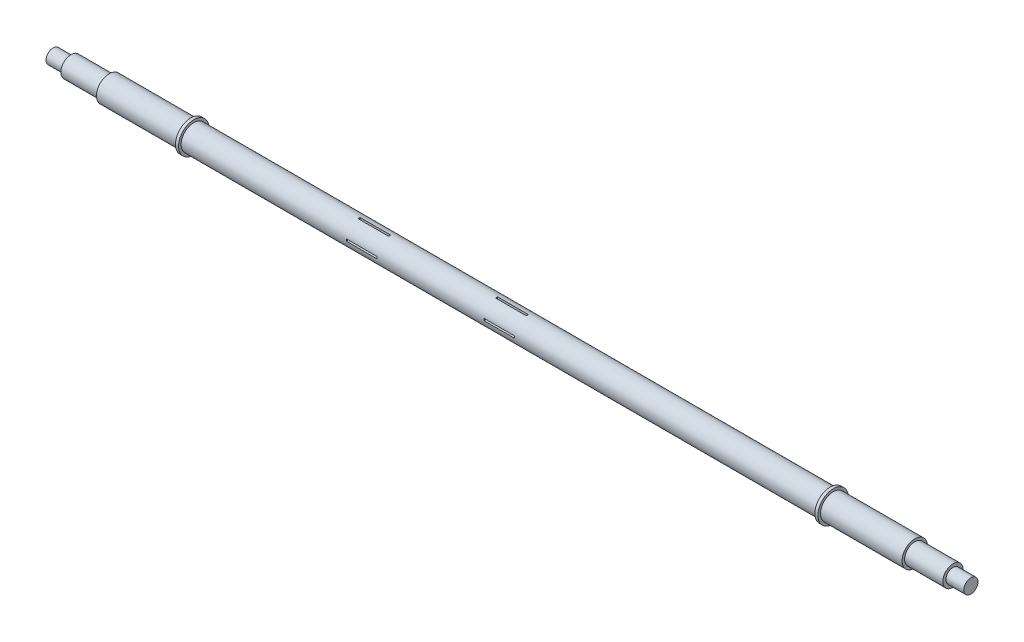
ISO-10303-21;
HEADER;
FILE_DESCRIPTION(('STEP AP214'),'2;1');
FILE_NAME('part.step','',(''),(''),'','','');
FILE_SCHEMA(('AUTOMOTIVE_DESIGN { 1 0 10303 214 1 1 1 1 }'));
ENDSEC;
DATA;
#1=APPLICATION_CONTEXT('core data for automotive mechanical design processes');
#2=APPLICATION_PROTOCOL_DEFINITION('international standard','automotive_design',2000,#1);
#3=PRODUCT_CONTEXT('',#1,'mechanical');
#4=PRODUCT('Part','Part','',(#3));
#5=PRODUCT_RELATED_PRODUCT_CATEGORY('part','',(#4));
#6=PRODUCT_DEFINITION_FORMATION('','',#4);
#7=PRODUCT_DEFINITION_CONTEXT('part definition',#1,'design');
#8=PRODUCT_DEFINITION('design','',#6,#7);
#9=PRODUCT_DEFINITION_SHAPE('','',#8);
#10=(LENGTH_UNIT() NAMED_UNIT(*) SI_UNIT(.MILLI.,.METRE.));
#11=(NAMED_UNIT(*) PLANE_ANGLE_UNIT() SI_UNIT($,.RADIAN.));
#12=(NAMED_UNIT(*) SI_UNIT($,.STERADIAN.) SOLID_ANGLE_UNIT());
#13=UNCERTAINTY_MEASURE_WITH_UNIT(LENGTH_MEASURE(1.E-05),#10,'distance_accuracy_value','');
#14=(GEOMETRIC_REPRESENTATION_CONTEXT(3) GLOBAL_UNCERTAINTY_ASSIGNED_CONTEXT((#13)) GLOBAL_UNIT_ASSIGNED_CONTEXT((#10,
#11,#12)) REPRESENTATION_CONTEXT('',''));
#15=CARTESIAN_POINT('',(0.,0.,0.));
#16=DIRECTION('',(0.,0.,1.));
#17=DIRECTION('',(1.,0.,0.));
#18=AXIS2_PLACEMENT_3D('',#15,#16,#17);
#19=CARTESIAN_POINT('',(-450.,0.,0.));
#20=DIRECTION('',(-1.,0.,0.));
#21=DIRECTION('',(0.,0.,1.));
#22=AXIS2_PLACEMENT_3D('',#19,#20,#21);
#23=CYLINDRICAL_SURFACE('',#22,12.5);
#24=CARTESIAN_POINT('',(-150.,0.,0.));
#25=DIRECTION('',(1.,0.,0.));
#26=DIRECTION('',(0.,0.,-1.));
#27=AXIS2_PLACEMENT_3D('',#24,#25,#26);
#28=CIRCLE('',#27,12.5);
#29=CARTESIAN_POINT('',(-150.,0.999999999999994,12.4599357943771));
#30=VERTEX_POINT('',#29);
#31=CARTESIAN_POINT('',(-150.,-0.999999999999996,12.4599357943771));
#32=VERTEX_POINT('',#31);
#33=EDGE_CURVE('E801',#30,#32,#28,.T.);
#34=ORIENTED_EDGE('',*,*,#33,.F.);
#35=DIRECTION('',(1.,0.,0.));
#36=VECTOR('',#35,1.);
#37=CARTESIAN_POINT('',(-150.,0.999999999999994,12.4599357943771));
#38=LINE('',#37,#36);
#39=CARTESIAN_POINT('',(-120.,0.999999999999994,12.4599357943771));
#40=VERTEX_POINT('',#39);
#41=EDGE_CURVE('E233',#30,#40,#38,.T.);
#42=ORIENTED_EDGE('',*,*,#41,.T.);
#43=CARTESIAN_POINT('',(-120.,0.,0.));
#44=DIRECTION('',(1.,0.,0.));
#45=DIRECTION('',(0.,0.,-1.));
#46=AXIS2_PLACEMENT_3D('',#43,#44,#45);
#47=CIRCLE('',#46,12.5);
#48=CARTESIAN_POINT('',(-120.,-0.999999999999996,12.4599357943771));
#49=VERTEX_POINT('',#48);
#50=EDGE_CURVE('E799',#40,#49,#47,.T.);
#51=ORIENTED_EDGE('',*,*,#50,.T.);
#52=DIRECTION('',(1.,0.,0.));
#53=VECTOR('',#52,1.);
#54=CARTESIAN_POINT('',(-150.,-0.999999999999996,12.4599357943771));
#55=LINE('',#54,#53);
#56=EDGE_CURVE('E795',#32,#49,#55,.T.);
#57=ORIENTED_EDGE('',*,*,#56,.F.);
#58=EDGE_LOOP('',(#34,#42,#51,#57));
#59=FACE_BOUND('',#58,.T.);
#60=CARTESIAN_POINT('',(-150.,0.,0.));
#61=DIRECTION('',(1.,0.,0.));
#62=DIRECTION('',(0.,0.,-1.));
#63=AXIS2_PLACEMENT_3D('',#60,#61,#62);
#64=CIRCLE('',#63,12.5);
#65=CARTESIAN_POINT('',(-150.,-1.,-12.4599357943771));
#66=VERTEX_POINT('',#65);
#67=CARTESIAN_POINT('',(-150.,0.999999999999995,-12.4599357943771));
#68=VERTEX_POINT('',#67);
#69=EDGE_CURVE('E822',#66,#68,#64,.T.);
#70=ORIENTED_EDGE('',*,*,#69,.F.);
#71=DIRECTION('',(1.,0.,0.));
#72=VECTOR('',#71,1.);
#73=CARTESIAN_POINT('',(-150.,-1.,-12.4599357943771));
#74=LINE('',#73,#72);
#75=CARTESIAN_POINT('',(-120.,-1.,-12.4599357943771));
#76=VERTEX_POINT('',#75);
#77=EDGE_CURVE('E782',#66,#76,#74,.T.);
#78=ORIENTED_EDGE('',*,*,#77,.T.);
#79=CARTESIAN_POINT('',(-120.,0.,0.));
#80=DIRECTION('',(1.,0.,0.));
#81=DIRECTION('',(0.,0.,-1.));
#82=AXIS2_PLACEMENT_3D('',#79,#80,#81);
#83=CIRCLE('',#82,12.5);
#84=CARTESIAN_POINT('',(-120.,0.999999999999995,-12.4599357943771));
#85=VERTEX_POINT('',#84);
#86=EDGE_CURVE('E842',#76,#85,#83,.T.);
#87=ORIENTED_EDGE('',*,*,#86,.T.);
#88=DIRECTION('',(1.,0.,0.));
#89=VECTOR('',#88,1.);
#90=CARTESIAN_POINT('',(-150.,0.999999999999995,-12.4599357943771));
#91=LINE('',#90,#89);
#92=EDGE_CURVE('E776',#68,#85,#91,.T.);
#93=ORIENTED_EDGE('',*,*,#92,.F.);
#94=EDGE_LOOP('',(#70,#78,#87,#93));
#95=FACE_BOUND('',#94,.T.);
#96=DIRECTION('',(-1.,0.,0.));
#97=VECTOR('',#96,1.);
#98=CARTESIAN_POINT('',(15.,12.4599357943771,-1.00000000000041));
#99=LINE('',#98,#97);
#100=CARTESIAN_POINT('',(15.,12.4599357943771,-1.00000000000041));
#101=VERTEX_POINT('',#100);
#102=CARTESIAN_POINT('',(-15.,12.4599357943771,-1.0000000000004));
#103=VERTEX_POINT('',#102);
#104=EDGE_CURVE('E321',#101,#103,#99,.T.);
#105=ORIENTED_EDGE('',*,*,#104,.F.);
#106=CARTESIAN_POINT('',(15.,0.,0.));
#107=DIRECTION('',(1.,0.,0.));
#108=DIRECTION('',(0.,0.,-1.));
#109=AXIS2_PLACEMENT_3D('',#106,#107,#108);
#110=CIRCLE('',#109,12.5);
#111=CARTESIAN_POINT('',(15.,12.4599357943771,1.00000000000012));
#112=VERTEX_POINT('',#111);
#113=EDGE_CURVE('E247',#101,#112,#110,.T.);
#114=ORIENTED_EDGE('',*,*,#113,.T.);
#115=DIRECTION('',(-1.,0.,0.));
#116=VECTOR('',#115,1.);
#117=CARTESIAN_POINT('',(15.,12.4599357943771,1.00000000000012));
#118=LINE('',#117,#116);
#119=CARTESIAN_POINT('',(-15.,12.4599357943771,1.00000000000012));
#120=VERTEX_POINT('',#119);
#121=EDGE_CURVE('E318',#112,#120,#118,.T.);
#122=ORIENTED_EDGE('',*,*,#121,.T.);
#123=CARTESIAN_POINT('',(-15.,0.,0.));
#124=DIRECTION('',(1.,0.,0.));
#125=DIRECTION('',(0.,0.,-1.));
#126=AXIS2_PLACEMENT_3D('',#123,#124,#125);
#127=CIRCLE('',#126,12.5);
#128=EDGE_CURVE('E278',#103,#120,#127,.T.);
#129=ORIENTED_EDGE('',*,*,#128,.F.);
#130=EDGE_LOOP('',(#105,#114,#122,#129));
#131=FACE_BOUND('',#130,.T.);
#132=DIRECTION('',(-1.,0.,0.));
#133=VECTOR('',#132,1.);
#134=CARTESIAN_POINT('',(15.,0.999999999999994,12.4599357943771));
#135=LINE('',#134,#133);
#136=CARTESIAN_POINT('',(15.,0.999999999999994,12.4599357943771));
#137=VERTEX_POINT('',#136);
#138=CARTESIAN_POINT('',(-15.,0.999999999999993,12.4599357943771));
#139=VERTEX_POINT('',#138);
#140=EDGE_CURVE('E313',#137,#139,#135,.T.);
#141=ORIENTED_EDGE('',*,*,#140,.F.);
#142=CARTESIAN_POINT('',(15.,0.,0.));
#143=DIRECTION('',(1.,0.,0.));
#144=DIRECTION('',(0.,0.,-1.));
#145=AXIS2_PLACEMENT_3D('',#142,#143,#144);
#146=CIRCLE('',#145,12.5);
#147=CARTESIAN_POINT('',(15.,-0.999999999999997,12.4599357943771));
#148=VERTEX_POINT('',#147);
#149=EDGE_CURVE('E254',#137,#148,#146,.T.);
#150=ORIENTED_EDGE('',*,*,#149,.T.);
#151=DIRECTION('',(-1.,0.,0.));
#152=VECTOR('',#151,1.);
#153=CARTESIAN_POINT('',(15.,-0.999999999999997,12.4599357943771));
#154=LINE('',#153,#152);
#155=CARTESIAN_POINT('',(-15.,-0.999999999999997,12.4599357943771));
#156=VERTEX_POINT('',#155);
#157=EDGE_CURVE('E310',#148,#156,#154,.T.);
#158=ORIENTED_EDGE('',*,*,#157,.T.);
#159=CARTESIAN_POINT('',(-15.,0.,0.));
#160=DIRECTION('',(1.,0.,0.));
#161=DIRECTION('',(0.,0.,-1.));
#162=AXIS2_PLACEMENT_3D('',#159,#160,#161);
#163=CIRCLE('',#162,12.5);
#164=EDGE_CURVE('E285',#139,#156,#163,.T.);
#165=ORIENTED_EDGE('',*,*,#164,.F.);
#166=EDGE_LOOP('',(#141,#150,#158,#165));
#167=FACE_BOUND('',#166,.T.);
#168=DIRECTION('',(-1.,0.,0.));
#169=VECTOR('',#168,1.);
#170=CARTESIAN_POINT('',(15.,-12.4599357943771,0.999999999999845));
#171=LINE('',#170,#169);
#172=CARTESIAN_POINT('',(15.,-12.4599357943771,0.999999999999845));
#173=VERTEX_POINT('',#172);
#174=CARTESIAN_POINT('',(-15.,-12.4599357943771,0.999999999999845));
#175=VERTEX_POINT('',#174);
#176=EDGE_CURVE('E305',#173,#175,#171,.T.);
#177=ORIENTED_EDGE('',*,*,#176,.F.);
#178=CARTESIAN_POINT('',(15.,0.,0.));
#179=DIRECTION('',(1.,0.,0.));
#180=DIRECTION('',(0.,0.,-1.));
#181=AXIS2_PLACEMENT_3D('',#178,#179,#180);
#182=CIRCLE('',#181,12.5);
#183=CARTESIAN_POINT('',(15.,-12.4599357943771,-0.999999999999872));
#184=VERTEX_POINT('',#183);
#185=EDGE_CURVE('E261',#173,#184,#182,.T.);
#186=ORIENTED_EDGE('',*,*,#185,.T.);
#187=DIRECTION('',(-1.,0.,0.));
#188=VECTOR('',#187,1.);
#189=CARTESIAN_POINT('',(15.,-12.4599357943771,-0.999999999999872));
#190=LINE('',#189,#188);
#191=CARTESIAN_POINT('',(-15.,-12.4599357943771,-0.999999999999872));
#192=VERTEX_POINT('',#191);
#193=EDGE_CURVE('E302',#184,#192,#190,.T.);
#194=ORIENTED_EDGE('',*,*,#193,.T.);
#195=CARTESIAN_POINT('',(-15.,0.,0.));
#196=DIRECTION('',(1.,0.,0.));
#197=DIRECTION('',(0.,0.,-1.));
#198=AXIS2_PLACEMENT_3D('',#195,#196,#197);
#199=CIRCLE('',#198,12.5);
#200=EDGE_CURVE('E292',#175,#192,#199,.T.);
#201=ORIENTED_EDGE('',*,*,#200,.F.);
#202=EDGE_LOOP('',(#177,#186,#194,#201));
#203=FACE_BOUND('',#202,.T.);
#204=DIRECTION('',(-1.,0.,0.));
#205=VECTOR('',#204,1.);
#206=CARTESIAN_POINT('',(15.,-0.999999999999996,-12.4599357943771));
#207=LINE('',#206,#205);
#208=CARTESIAN_POINT('',(15.,-0.999999999999996,-12.4599357943771));
#209=VERTEX_POINT('',#208);
#210=CARTESIAN_POINT('',(-15.,-0.999999999999995,-12.4599357943771));
#211=VERTEX_POINT('',#210);
#212=EDGE_CURVE('E268',#209,#211,#207,.T.);
#213=ORIENTED_EDGE('',*,*,#212,.F.);
#214=CARTESIAN_POINT('',(15.,0.,0.));
#215=DIRECTION('',(1.,0.,0.));
#216=DIRECTION('',(0.,0.,-1.));
#217=AXIS2_PLACEMENT_3D('',#214,#215,#216);
#218=CIRCLE('',#217,12.5);
#219=CARTESIAN_POINT('',(15.,0.999999999999995,-12.4599357943771));
#220=VERTEX_POINT('',#219);
#221=EDGE_CURVE('E239',#209,#220,#218,.T.);
#222=ORIENTED_EDGE('',*,*,#221,.T.);
#223=DIRECTION('',(-1.,0.,0.));
#224=VECTOR('',#223,1.);
#225=CARTESIAN_POINT('',(15.,0.999999999999995,-12.4599357943771));
#226=LINE('',#225,#224);
#227=CARTESIAN_POINT('',(-15.,0.999999999999995,-12.4599357943771));
#228=VERTEX_POINT('',#227);
#229=EDGE_CURVE('E326',#220,#228,#226,.T.);
#230=ORIENTED_EDGE('',*,*,#229,.T.);
#231=CARTESIAN_POINT('',(-15.,0.,0.));
#232=DIRECTION('',(1.,0.,0.));
#233=DIRECTION('',(0.,0.,-1.));
#234=AXIS2_PLACEMENT_3D('',#231,#232,#233);
#235=CIRCLE('',#234,12.5);
#236=EDGE_CURVE('E269',#211,#228,#235,.T.);
#237=ORIENTED_EDGE('',*,*,#236,.F.);
#238=EDGE_LOOP('',(#213,#222,#230,#237));
#239=FACE_BOUND('',#238,.T.);
#240=CARTESIAN_POINT('',(-312.,0.,0.));
#241=DIRECTION('',(1.,0.,0.));
#242=DIRECTION('',(0.,0.,-1.));
#243=AXIS2_PLACEMENT_3D('',#240,#241,#242);
#244=CIRCLE('',#243,12.5);
#245=CARTESIAN_POINT('',(-312.,0.,-12.5));
#246=VERTEX_POINT('',#245);
#247=EDGE_CURVE('E339',#246,#246,#244,.T.);
#248=ORIENTED_EDGE('',*,*,#247,.T.);
#249=EDGE_LOOP('',(#248));
#250=FACE_BOUND('',#249,.T.);
#251=CARTESIAN_POINT('',(312.,0.,0.));
#252=DIRECTION('',(1.,0.,0.));
#253=DIRECTION('',(0.,0.,-1.));
#254=AXIS2_PLACEMENT_3D('',#251,#252,#253);
#255=CIRCLE('',#254,12.5);
#256=CARTESIAN_POINT('',(312.,0.,-12.5));
#257=VERTEX_POINT('',#256);
#258=EDGE_CURVE('E11',#257,#257,#255,.T.);
#259=ORIENTED_EDGE('',*,*,#258,.F.);
#260=EDGE_LOOP('',(#259));
#261=FACE_BOUND('',#260,.T.);
#262=CARTESIAN_POINT('',(-150.,0.,0.));
#263=DIRECTION('',(1.,0.,0.));
#264=DIRECTION('',(0.,0.,-1.));
#265=AXIS2_PLACEMENT_3D('',#262,#263,#264);
#266=CIRCLE('',#265,12.5);
#267=CARTESIAN_POINT('',(-150.,-12.4599357943771,0.999999999999845));
#268=VERTEX_POINT('',#267);
#269=CARTESIAN_POINT('',(-150.,-12.4599357943771,-0.999999999999863));
#270=VERTEX_POINT('',#269);
#271=EDGE_CURVE('E813',#268,#270,#266,.T.);
#272=ORIENTED_EDGE('',*,*,#271,.F.);
#273=DIRECTION('',(1.,0.,0.));
#274=VECTOR('',#273,1.);
#275=CARTESIAN_POINT('',(-150.,-12.4599357943771,0.999999999999845));
#276=LINE('',#275,#274);
#277=CARTESIAN_POINT('',(-120.,-12.4599357943771,0.999999999999845));
#278=VERTEX_POINT('',#277);
#279=EDGE_CURVE('E790',#268,#278,#276,.T.);
#280=ORIENTED_EDGE('',*,*,#279,.T.);
#281=CARTESIAN_POINT('',(-120.,0.,0.));
#282=DIRECTION('',(1.,0.,0.));
#283=DIRECTION('',(0.,0.,-1.));
#284=AXIS2_PLACEMENT_3D('',#281,#282,#283);
#285=CIRCLE('',#284,12.5);
#286=CARTESIAN_POINT('',(-120.,-12.4599357943771,-0.999999999999862));
#287=VERTEX_POINT('',#286);
#288=EDGE_CURVE('E833',#278,#287,#285,.T.);
#289=ORIENTED_EDGE('',*,*,#288,.T.);
#290=DIRECTION('',(1.,0.,0.));
#291=VECTOR('',#290,1.);
#292=CARTESIAN_POINT('',(-150.,-12.4599357943771,-0.999999999999863));
#293=LINE('',#292,#291);
#294=EDGE_CURVE('E787',#270,#287,#293,.T.);
#295=ORIENTED_EDGE('',*,*,#294,.F.);
#296=EDGE_LOOP('',(#272,#280,#289,#295));
#297=FACE_BOUND('',#296,.T.);
#298=CARTESIAN_POINT('',(-150.,0.,0.));
#299=DIRECTION('',(1.,0.,0.));
#300=DIRECTION('',(0.,0.,-1.));
#301=AXIS2_PLACEMENT_3D('',#298,#299,#300);
#302=CIRCLE('',#301,12.5);
#303=CARTESIAN_POINT('',(-150.,12.4599357943771,-1.0000000000004));
#304=VERTEX_POINT('',#303);
#305=CARTESIAN_POINT('',(-150.,12.4599357943771,1.00000000000012));
#306=VERTEX_POINT('',#305);
#307=EDGE_CURVE('E219',#304,#306,#302,.T.);
#308=ORIENTED_EDGE('',*,*,#307,.F.);
#309=DIRECTION('',(1.,0.,0.));
#310=VECTOR('',#309,1.);
#311=CARTESIAN_POINT('',(-150.,12.4599357943771,-1.0000000000004));
#312=LINE('',#311,#310);
#313=CARTESIAN_POINT('',(-120.,12.4599357943771,-1.0000000000004));
#314=VERTEX_POINT('',#313);
#315=EDGE_CURVE('E273',#304,#314,#312,.T.);
#316=ORIENTED_EDGE('',*,*,#315,.T.);
#317=CARTESIAN_POINT('',(-120.,0.,0.));
#318=DIRECTION('',(1.,0.,0.));
#319=DIRECTION('',(0.,0.,-1.));
#320=AXIS2_PLACEMENT_3D('',#317,#318,#319);
#321=CIRCLE('',#320,12.5);
#322=CARTESIAN_POINT('',(-120.,12.4599357943771,1.00000000000012));
#323=VERTEX_POINT('',#322);
#324=EDGE_CURVE('E231',#314,#323,#321,.T.);
#325=ORIENTED_EDGE('',*,*,#324,.T.);
#326=DIRECTION('',(1.,0.,0.));
#327=VECTOR('',#326,1.);
#328=CARTESIAN_POINT('',(-150.,12.4599357943771,1.00000000000012));
#329=LINE('',#328,#327);
#330=EDGE_CURVE('E212',#306,#323,#329,.T.);
#331=ORIENTED_EDGE('',*,*,#330,.F.);
#332=EDGE_LOOP('',(#308,#316,#325,#331));
#333=FACE_BOUND('',#332,.T.);
#334=ADVANCED_FACE('F47',(#59,#95,#131,#167,#203,#239,#250,#261,#297,#333),#23,.T.);
#335=CARTESIAN_POINT('',(-312.,0.,0.));
#336=DIRECTION('',(-1.,0.,0.));
#337=DIRECTION('',(0.,0.,1.));
#338=AXIS2_PLACEMENT_3D('',#335,#336,#337);
#339=CYLINDRICAL_SURFACE('',#338,15.);
#340=CARTESIAN_POINT('',(-312.,0.,0.));
#341=DIRECTION('',(1.,0.,0.));
#342=DIRECTION('',(0.,0.,-1.));
#343=AXIS2_PLACEMENT_3D('',#340,#341,#342);
#344=CIRCLE('',#343,15.);
#345=CARTESIAN_POINT('',(-312.,0.,-15.));
#346=VERTEX_POINT('',#345);
#347=EDGE_CURVE('E336',#346,#346,#344,.T.);
#348=ORIENTED_EDGE('',*,*,#347,.F.);
#349=EDGE_LOOP('',(#348));
#350=FACE_BOUND('',#349,.T.);
#351=CARTESIAN_POINT('',(-315.,0.,0.));
#352=DIRECTION('',(1.,0.,0.));
#353=DIRECTION('',(0.,0.,-1.));
#354=AXIS2_PLACEMENT_3D('',#351,#352,#353);
#355=CIRCLE('',#354,15.);
#356=CARTESIAN_POINT('',(-315.,0.,-15.));
#357=VERTEX_POINT('',#356);
#358=EDGE_CURVE('E340',#357,#357,#355,.T.);
#359=ORIENTED_EDGE('',*,*,#358,.T.);
#360=EDGE_LOOP('',(#359));
#361=FACE_BOUND('',#360,.T.);
#362=ADVANCED_FACE('F405',(#350,#361),#339,.T.);
#363=CARTESIAN_POINT('',(-312.,0.,0.));
#364=DIRECTION('',(1.,0.,0.));
#365=DIRECTION('',(0.,0.,-1.));
#366=AXIS2_PLACEMENT_3D('',#363,#364,#365);
#367=PLANE('',#366);
#368=ORIENTED_EDGE('',*,*,#247,.F.);
#369=EDGE_LOOP('',(#368));
#370=FACE_BOUND('',#369,.T.);
#371=ORIENTED_EDGE('',*,*,#347,.T.);
#372=EDGE_LOOP('',(#371));
#373=FACE_BOUND('',#372,.T.);
#374=ADVANCED_FACE('F412',(#370,#373),#367,.T.);
#375=CARTESIAN_POINT('',(-315.,0.,0.));
#376=DIRECTION('',(1.,0.,0.));
#377=DIRECTION('',(0.,0.,-1.));
#378=AXIS2_PLACEMENT_3D('',#375,#376,#377);
#379=PLANE('',#378);
#380=CARTESIAN_POINT('',(-315.,0.,0.));
#381=DIRECTION('',(1.,0.,0.));
#382=DIRECTION('',(0.,0.,-1.));
#383=AXIS2_PLACEMENT_3D('',#380,#381,#382);
#384=CIRCLE('',#383,12.5);
#385=CARTESIAN_POINT('',(-315.,0.,-12.5));
#386=VERTEX_POINT('',#385);
#387=EDGE_CURVE('E55',#386,#386,#384,.T.);
#388=ORIENTED_EDGE('',*,*,#387,.T.);
#389=EDGE_LOOP('',(#388));
#390=FACE_BOUND('',#389,.T.);
#391=ORIENTED_EDGE('',*,*,#358,.F.);
#392=EDGE_LOOP('',(#391));
#393=FACE_BOUND('',#392,.T.);
#394=ADVANCED_FACE('F528',(#390,#393),#379,.F.);
#395=CARTESIAN_POINT('',(-450.,0.,0.));
#396=DIRECTION('',(1.,0.,0.));
#397=DIRECTION('',(0.,0.,-1.));
#398=AXIS2_PLACEMENT_3D('',#395,#396,#397);
#399=PLANE('',#398);
#400=CARTESIAN_POINT('',(-450.,0.,0.));
#401=DIRECTION('',(-1.,0.,0.));
#402=DIRECTION('',(0.,0.,1.));
#403=AXIS2_PLACEMENT_3D('',#400,#401,#402);
#404=CIRCLE('',#403,7.);
#405=CARTESIAN_POINT('',(-450.,0.,7.));
#406=VERTEX_POINT('',#405);
#407=EDGE_CURVE('E343',#406,#406,#404,.T.);
#408=ORIENTED_EDGE('',*,*,#407,.T.);
#409=EDGE_LOOP('',(#408));
#410=FACE_BOUND('',#409,.T.);
#411=ADVANCED_FACE('F518',(#410),#399,.F.);
#412=CARTESIAN_POINT('',(-450.,0.,0.));
#413=DIRECTION('',(-1.,0.,0.));
#414=DIRECTION('',(0.,0.,1.));
#415=AXIS2_PLACEMENT_3D('',#412,#413,#414);
#416=CYLINDRICAL_SURFACE('',#415,7.);
#417=ORIENTED_EDGE('',*,*,#407,.F.);
#418=EDGE_LOOP('',(#417));
#419=FACE_BOUND('',#418,.T.);
#420=CARTESIAN_POINT('',(-432.5,0.,0.));
#421=DIRECTION('',(-1.,0.,0.));
#422=DIRECTION('',(0.,0.,1.));
#423=AXIS2_PLACEMENT_3D('',#420,#421,#422);
#424=CIRCLE('',#423,7.);
#425=CARTESIAN_POINT('',(-432.5,0.,7.));
#426=VERTEX_POINT('',#425);
#427=EDGE_CURVE('E346',#426,#426,#424,.T.);
#428=ORIENTED_EDGE('',*,*,#427,.T.);
#429=EDGE_LOOP('',(#428));
#430=FACE_BOUND('',#429,.T.);
#431=ADVANCED_FACE('F508',(#419,#430),#416,.T.);
#432=CARTESIAN_POINT('',(-432.5,7.,0.));
#433=DIRECTION('',(1.,0.,0.));
#434=DIRECTION('',(0.,0.,-1.));
#435=AXIS2_PLACEMENT_3D('',#432,#433,#434);
#436=PLANE('',#435);
#437=ORIENTED_EDGE('',*,*,#427,.F.);
#438=EDGE_LOOP('',(#437));
#439=FACE_BOUND('',#438,.T.);
#440=CARTESIAN_POINT('',(-432.5,0.,0.));
#441=DIRECTION('',(-1.,0.,0.));
#442=DIRECTION('',(0.,0.,1.));
#443=AXIS2_PLACEMENT_3D('',#440,#441,#442);
#444=CIRCLE('',#443,10.);
#445=CARTESIAN_POINT('',(-432.5,0.,10.));
#446=VERTEX_POINT('',#445);
#447=EDGE_CURVE('E349',#446,#446,#444,.T.);
#448=ORIENTED_EDGE('',*,*,#447,.T.);
#449=EDGE_LOOP('',(#448));
#450=FACE_BOUND('',#449,.T.);
#451=ADVANCED_FACE('F498',(#439,#450),#436,.F.);
#452=CARTESIAN_POINT('',(-450.,0.,0.));
#453=DIRECTION('',(-1.,0.,0.));
#454=DIRECTION('',(0.,0.,1.));
#455=AXIS2_PLACEMENT_3D('',#452,#453,#454);
#456=CYLINDRICAL_SURFACE('',#455,9.99999999999999);
#457=ORIENTED_EDGE('',*,*,#447,.F.);
#458=EDGE_LOOP('',(#457));
#459=FACE_BOUND('',#458,.T.);
#460=CARTESIAN_POINT('',(-395.,0.,0.));
#461=DIRECTION('',(-1.,0.,0.));
#462=DIRECTION('',(0.,0.,1.));
#463=AXIS2_PLACEMENT_3D('',#460,#461,#462);
#464=CIRCLE('',#463,9.99999999999999);
#465=CARTESIAN_POINT('',(-395.,0.,9.99999999999999));
#466=VERTEX_POINT('',#465);
#467=EDGE_CURVE('E352',#466,#466,#464,.T.);
#468=ORIENTED_EDGE('',*,*,#467,.T.);
#469=EDGE_LOOP('',(#468));
#470=FACE_BOUND('',#469,.T.);
#471=ADVANCED_FACE('F489',(#459,#470),#456,.T.);
#472=CARTESIAN_POINT('',(-395.,9.99999999999999,0.));
#473=DIRECTION('',(1.,0.,0.));
#474=DIRECTION('',(0.,0.,-1.));
#475=AXIS2_PLACEMENT_3D('',#472,#473,#474);
#476=PLANE('',#475);
#477=ORIENTED_EDGE('',*,*,#467,.F.);
#478=EDGE_LOOP('',(#477));
#479=FACE_BOUND('',#478,.T.);
#480=CARTESIAN_POINT('',(-395.,0.,0.));
#481=DIRECTION('',(-1.,0.,0.));
#482=DIRECTION('',(0.,0.,1.));
#483=AXIS2_PLACEMENT_3D('',#480,#481,#482);
#484=CIRCLE('',#483,12.5);
#485=CARTESIAN_POINT('',(-395.,0.,12.5));
#486=VERTEX_POINT('',#485);
#487=EDGE_CURVE('E355',#486,#486,#484,.T.);
#488=ORIENTED_EDGE('',*,*,#487,.T.);
#489=EDGE_LOOP('',(#488));
#490=FACE_BOUND('',#489,.T.);
#491=ADVANCED_FACE('F400',(#479,#490),#476,.F.);
#492=ORIENTED_EDGE('',*,*,#487,.F.);
#493=EDGE_LOOP('',(#492));
#494=FACE_BOUND('',#493,.T.);
#495=ORIENTED_EDGE('',*,*,#387,.F.);
#496=EDGE_LOOP('',(#495));
#497=FACE_BOUND('',#496,.T.);
#498=ADVANCED_FACE('F391',(#494,#497),#23,.T.);
#499=CARTESIAN_POINT('',(312.,0.,0.));
#500=DIRECTION('',(1.,0.,0.));
#501=DIRECTION('',(0.,0.,-1.));
#502=AXIS2_PLACEMENT_3D('',#499,#500,#501);
#503=CYLINDRICAL_SURFACE('',#502,15.);
#504=CARTESIAN_POINT('',(312.,0.,0.));
#505=DIRECTION('',(1.,0.,0.));
#506=DIRECTION('',(0.,0.,-1.));
#507=AXIS2_PLACEMENT_3D('',#504,#505,#506);
#508=CIRCLE('',#507,15.);
#509=CARTESIAN_POINT('',(312.,0.,-15.));
#510=VERTEX_POINT('',#509);
#511=EDGE_CURVE('E330',#510,#510,#508,.T.);
#512=ORIENTED_EDGE('',*,*,#511,.T.);
#513=EDGE_LOOP('',(#512));
#514=FACE_BOUND('',#513,.T.);
#515=CARTESIAN_POINT('',(315.,0.,0.));
#516=DIRECTION('',(1.,0.,0.));
#517=DIRECTION('',(0.,0.,-1.));
#518=AXIS2_PLACEMENT_3D('',#515,#516,#517);
#519=CIRCLE('',#518,15.);
#520=CARTESIAN_POINT('',(315.,0.,-15.));
#521=VERTEX_POINT('',#520);
#522=EDGE_CURVE('E329',#521,#521,#519,.T.);
#523=ORIENTED_EDGE('',*,*,#522,.F.);
#524=EDGE_LOOP('',(#523));
#525=FACE_BOUND('',#524,.T.);
#526=ADVANCED_FACE('F389',(#514,#525),#503,.T.);
#527=CARTESIAN_POINT('',(312.,0.,0.));
#528=DIRECTION('',(1.,0.,0.));
#529=DIRECTION('',(0.,0.,-1.));
#530=AXIS2_PLACEMENT_3D('',#527,#528,#529);
#531=PLANE('',#530);
#532=ORIENTED_EDGE('',*,*,#258,.T.);
#533=EDGE_LOOP('',(#532));
#534=FACE_BOUND('',#533,.T.);
#535=ORIENTED_EDGE('',*,*,#511,.F.);
#536=EDGE_LOOP('',(#535));
#537=FACE_BOUND('',#536,.T.);
#538=ADVANCED_FACE('F385',(#534,#537),#531,.F.);
#539=CARTESIAN_POINT('',(315.,0.,0.));
#540=DIRECTION('',(1.,0.,0.));
#541=DIRECTION('',(0.,0.,-1.));
#542=AXIS2_PLACEMENT_3D('',#539,#540,#541);
#543=PLANE('',#542);
#544=CARTESIAN_POINT('',(315.,0.,0.));
#545=DIRECTION('',(1.,0.,0.));
#546=DIRECTION('',(0.,0.,-1.));
#547=AXIS2_PLACEMENT_3D('',#544,#545,#546);
#548=CIRCLE('',#547,12.5);
#549=CARTESIAN_POINT('',(315.,0.,-12.5));
#550=VERTEX_POINT('',#549);
#551=EDGE_CURVE('E333',#550,#550,#548,.T.);
#552=ORIENTED_EDGE('',*,*,#551,.F.);
#553=EDGE_LOOP('',(#552));
#554=FACE_BOUND('',#553,.T.);
#555=ORIENTED_EDGE('',*,*,#522,.T.);
#556=EDGE_LOOP('',(#555));
#557=FACE_BOUND('',#556,.T.);
#558=ADVANCED_FACE('F382',(#554,#557),#543,.T.);
#559=CARTESIAN_POINT('',(450.,0.,0.));
#560=DIRECTION('',(-1.,0.,0.));
#561=DIRECTION('',(0.,0.,1.));
#562=AXIS2_PLACEMENT_3D('',#559,#560,#561);
#563=PLANE('',#562);
#564=CARTESIAN_POINT('',(450.,0.,0.));
#565=DIRECTION('',(-1.,0.,0.));
#566=DIRECTION('',(0.,0.,1.));
#567=AXIS2_PLACEMENT_3D('',#564,#565,#566);
#568=CIRCLE('',#567,7.);
#569=CARTESIAN_POINT('',(450.,0.,7.));
#570=VERTEX_POINT('',#569);
#571=EDGE_CURVE('E370',#570,#570,#568,.T.);
#572=ORIENTED_EDGE('',*,*,#571,.F.);
#573=EDGE_LOOP('',(#572));
#574=FACE_BOUND('',#573,.T.);
#575=ADVANCED_FACE('F49',(#574),#563,.F.);
#576=CARTESIAN_POINT('',(-450.,0.,0.));
#577=DIRECTION('',(-1.,0.,0.));
#578=DIRECTION('',(0.,0.,1.));
#579=AXIS2_PLACEMENT_3D('',#576,#577,#578);
#580=CYLINDRICAL_SURFACE('',#579,7.);
#581=CARTESIAN_POINT('',(432.5,0.,0.));
#582=DIRECTION('',(-1.,0.,0.));
#583=DIRECTION('',(0.,0.,1.));
#584=AXIS2_PLACEMENT_3D('',#581,#582,#583);
#585=CIRCLE('',#584,7.);
#586=CARTESIAN_POINT('',(432.5,0.,7.));
#587=VERTEX_POINT('',#586);
#588=EDGE_CURVE('E367',#587,#587,#585,.T.);
#589=ORIENTED_EDGE('',*,*,#588,.F.);
#590=EDGE_LOOP('',(#589));
#591=FACE_BOUND('',#590,.T.);
#592=ORIENTED_EDGE('',*,*,#571,.T.);
#593=EDGE_LOOP('',(#592));
#594=FACE_BOUND('',#593,.T.);
#595=ADVANCED_FACE('F442',(#591,#594),#580,.T.);
#596=CARTESIAN_POINT('',(432.5,7.,0.));
#597=DIRECTION('',(-1.,0.,0.));
#598=DIRECTION('',(0.,0.,1.));
#599=AXIS2_PLACEMENT_3D('',#596,#597,#598);
#600=PLANE('',#599);
#601=CARTESIAN_POINT('',(432.5,0.,0.));
#602=DIRECTION('',(-1.,0.,0.));
#603=DIRECTION('',(0.,0.,1.));
#604=AXIS2_PLACEMENT_3D('',#601,#602,#603);
#605=CIRCLE('',#604,10.);
#606=CARTESIAN_POINT('',(432.5,0.,10.));
#607=VERTEX_POINT('',#606);
#608=EDGE_CURVE('E364',#607,#607,#605,.T.);
#609=ORIENTED_EDGE('',*,*,#608,.F.);
#610=EDGE_LOOP('',(#609));
#611=FACE_BOUND('',#610,.T.);
#612=ORIENTED_EDGE('',*,*,#588,.T.);
#613=EDGE_LOOP('',(#612));
#614=FACE_BOUND('',#613,.T.);
#615=ADVANCED_FACE('F435',(#611,#614),#600,.F.);
#616=CARTESIAN_POINT('',(-450.,0.,0.));
#617=DIRECTION('',(-1.,0.,0.));
#618=DIRECTION('',(0.,0.,1.));
#619=AXIS2_PLACEMENT_3D('',#616,#617,#618);
#620=CYLINDRICAL_SURFACE('',#619,9.99999999999999);
#621=CARTESIAN_POINT('',(395.,0.,0.));
#622=DIRECTION('',(-1.,0.,0.));
#623=DIRECTION('',(0.,0.,1.));
#624=AXIS2_PLACEMENT_3D('',#621,#622,#623);
#625=CIRCLE('',#624,9.99999999999999);
#626=CARTESIAN_POINT('',(395.,0.,9.99999999999999));
#627=VERTEX_POINT('',#626);
#628=EDGE_CURVE('E361',#627,#627,#625,.T.);
#629=ORIENTED_EDGE('',*,*,#628,.F.);
#630=EDGE_LOOP('',(#629));
#631=FACE_BOUND('',#630,.T.);
#632=ORIENTED_EDGE('',*,*,#608,.T.);
#633=EDGE_LOOP('',(#632));
#634=FACE_BOUND('',#633,.T.);
#635=ADVANCED_FACE('F429',(#631,#634),#620,.T.);
#636=CARTESIAN_POINT('',(395.,9.99999999999999,0.));
#637=DIRECTION('',(-1.,0.,0.));
#638=DIRECTION('',(0.,0.,1.));
#639=AXIS2_PLACEMENT_3D('',#636,#637,#638);
#640=PLANE('',#639);
#641=CARTESIAN_POINT('',(395.,0.,0.));
#642=DIRECTION('',(-1.,0.,0.));
#643=DIRECTION('',(0.,0.,1.));
#644=AXIS2_PLACEMENT_3D('',#641,#642,#643);
#645=CIRCLE('',#644,12.5);
#646=CARTESIAN_POINT('',(395.,0.,12.5));
#647=VERTEX_POINT('',#646);
#648=EDGE_CURVE('E358',#647,#647,#645,.T.);
#649=ORIENTED_EDGE('',*,*,#648,.F.);
#650=EDGE_LOOP('',(#649));
#651=FACE_BOUND('',#650,.T.);
#652=ORIENTED_EDGE('',*,*,#628,.T.);
#653=EDGE_LOOP('',(#652));
#654=FACE_BOUND('',#653,.T.);
#655=ADVANCED_FACE('F421',(#651,#654),#640,.F.);
#656=ORIENTED_EDGE('',*,*,#551,.T.);
#657=EDGE_LOOP('',(#656));
#658=FACE_BOUND('',#657,.T.);
#659=ORIENTED_EDGE('',*,*,#648,.T.);
#660=EDGE_LOOP('',(#659));
#661=FACE_BOUND('',#660,.T.);
#662=ADVANCED_FACE('F379',(#658,#661),#23,.T.);
#663=CARTESIAN_POINT('',(15.,0.999999999999997,-1.00000000000016));
#664=DIRECTION('',(0.,-1.,0.));
#665=DIRECTION('',(0.,0.,-1.));
#666=AXIS2_PLACEMENT_3D('',#663,#664,#665);
#667=PLANE('',#666);
#668=DIRECTION('',(0.,0.,1.));
#669=VECTOR('',#668,1.);
#670=CARTESIAN_POINT('',(-15.,0.999999999999997,-1.00000000000016));
#671=LINE('',#670,#669);
#672=CARTESIAN_POINT('',(-15.,0.999999999999997,-1.00000000000016));
#673=VERTEX_POINT('',#672);
#674=EDGE_CURVE('E272',#228,#673,#671,.T.);
#675=ORIENTED_EDGE('',*,*,#674,.F.);
#676=ORIENTED_EDGE('',*,*,#229,.F.);
#677=DIRECTION('',(0.,0.,1.));
#678=VECTOR('',#677,1.);
#679=CARTESIAN_POINT('',(15.,0.999999999999997,-1.00000000000016));
#680=LINE('',#679,#678);
#681=CARTESIAN_POINT('',(15.,0.999999999999997,-1.00000000000016));
#682=VERTEX_POINT('',#681);
#683=EDGE_CURVE('E242',#220,#682,#680,.T.);
#684=ORIENTED_EDGE('',*,*,#683,.T.);
#685=DIRECTION('',(-1.,0.,0.));
#686=VECTOR('',#685,1.);
#687=CARTESIAN_POINT('',(15.,0.999999999999997,-1.00000000000016));
#688=LINE('',#687,#686);
#689=EDGE_CURVE('E323',#682,#673,#688,.T.);
#690=ORIENTED_EDGE('',*,*,#689,.T.);
#691=EDGE_LOOP('',(#675,#676,#684,#690));
#692=FACE_BOUND('',#691,.T.);
#693=ADVANCED_FACE('F420',(#692),#667,.T.);
#694=CARTESIAN_POINT('',(15.,12.4599357943771,-1.0000000000004));
#695=DIRECTION('',(0.,0.,1.));
#696=DIRECTION('',(0.,-1.,0.));
#697=AXIS2_PLACEMENT_3D('',#694,#695,#696);
#698=PLANE('',#697);
#699=DIRECTION('',(0.,1.,0.));
#700=VECTOR('',#699,1.);
#701=CARTESIAN_POINT('',(-15.,12.4599357943771,-1.0000000000004));
#702=LINE('',#701,#700);
#703=EDGE_CURVE('E275',#673,#103,#702,.T.);
#704=ORIENTED_EDGE('',*,*,#703,.F.);
#705=ORIENTED_EDGE('',*,*,#689,.F.);
#706=DIRECTION('',(0.,1.,0.));
#707=VECTOR('',#706,1.);
#708=CARTESIAN_POINT('',(15.,12.4599357943771,-1.0000000000004));
#709=LINE('',#708,#707);
#710=EDGE_CURVE('E245',#682,#101,#709,.T.);
#711=ORIENTED_EDGE('',*,*,#710,.T.);
#712=ORIENTED_EDGE('',*,*,#104,.T.);
#713=EDGE_LOOP('',(#704,#705,#711,#712));
#714=FACE_BOUND('',#713,.T.);
#715=ADVANCED_FACE('F425',(#714),#698,.T.);
#716=CARTESIAN_POINT('',(15.,12.4599357943771,1.00000000000012));
#717=DIRECTION('',(0.,0.,-1.));
#718=DIRECTION('',(0.,1.,0.));
#719=AXIS2_PLACEMENT_3D('',#716,#717,#718);
#720=PLANE('',#719);
#721=DIRECTION('',(0.,-1.,0.));
#722=VECTOR('',#721,1.);
#723=CARTESIAN_POINT('',(-15.,12.4599357943771,1.00000000000012));
#724=LINE('',#723,#722);
#725=CARTESIAN_POINT('',(-15.,0.999999999999997,0.999999999999995));
#726=VERTEX_POINT('',#725);
#727=EDGE_CURVE('E280',#120,#726,#724,.T.);
#728=ORIENTED_EDGE('',*,*,#727,.F.);
#729=ORIENTED_EDGE('',*,*,#121,.F.);
#730=DIRECTION('',(0.,-1.,0.));
#731=VECTOR('',#730,1.);
#732=CARTESIAN_POINT('',(15.,12.4599357943771,1.00000000000012));
#733=LINE('',#732,#731);
#734=CARTESIAN_POINT('',(15.,0.999999999999997,0.999999999999995));
#735=VERTEX_POINT('',#734);
#736=EDGE_CURVE('E250',#112,#735,#733,.T.);
#737=ORIENTED_EDGE('',*,*,#736,.T.);
#738=DIRECTION('',(-1.,0.,0.));
#739=VECTOR('',#738,1.);
#740=CARTESIAN_POINT('',(15.,0.999999999999997,0.999999999999995));
#741=LINE('',#740,#739);
#742=EDGE_CURVE('E315',#735,#726,#741,.T.);
#743=ORIENTED_EDGE('',*,*,#742,.T.);
#744=EDGE_LOOP('',(#728,#729,#737,#743));
#745=FACE_BOUND('',#744,.T.);
#746=ADVANCED_FACE('F588',(#745),#720,.T.);
#747=CARTESIAN_POINT('',(15.,0.999999999999996,12.4599357943771));
#748=DIRECTION('',(0.,-1.,0.));
#749=DIRECTION('',(0.,0.,-1.));
#750=AXIS2_PLACEMENT_3D('',#747,#748,#749);
#751=PLANE('',#750);
#752=DIRECTION('',(0.,0.,1.));
#753=VECTOR('',#752,1.);
#754=CARTESIAN_POINT('',(-15.,0.999999999999996,12.4599357943771));
#755=LINE('',#754,#753);
#756=EDGE_CURVE('E282',#726,#139,#755,.T.);
#757=ORIENTED_EDGE('',*,*,#756,.F.);
#758=ORIENTED_EDGE('',*,*,#742,.F.);
#759=DIRECTION('',(0.,0.,1.));
#760=VECTOR('',#759,1.);
#761=CARTESIAN_POINT('',(15.,0.999999999999996,12.4599357943771));
#762=LINE('',#761,#760);
#763=EDGE_CURVE('E252',#735,#137,#762,.T.);
#764=ORIENTED_EDGE('',*,*,#763,.T.);
#765=ORIENTED_EDGE('',*,*,#140,.T.);
#766=EDGE_LOOP('',(#757,#758,#764,#765));
#767=FACE_BOUND('',#766,.T.);
#768=ADVANCED_FACE('F598',(#767),#751,.T.);
#769=CARTESIAN_POINT('',(15.,-0.999999999999997,12.4599357943771));
#770=DIRECTION('',(0.,1.,0.));
#771=DIRECTION('',(0.,0.,1.));
#772=AXIS2_PLACEMENT_3D('',#769,#770,#771);
#773=PLANE('',#772);
#774=DIRECTION('',(0.,0.,-1.));
#775=VECTOR('',#774,1.);
#776=CARTESIAN_POINT('',(-15.,-0.999999999999997,12.4599357943771));
#777=LINE('',#776,#775);
#778=CARTESIAN_POINT('',(-15.,-0.999999999999997,0.999999999999973));
#779=VERTEX_POINT('',#778);
#780=EDGE_CURVE('E287',#156,#779,#777,.T.);
#781=ORIENTED_EDGE('',*,*,#780,.F.);
#782=ORIENTED_EDGE('',*,*,#157,.F.);
#783=DIRECTION('',(0.,0.,-1.));
#784=VECTOR('',#783,1.);
#785=CARTESIAN_POINT('',(15.,-0.999999999999997,12.4599357943771));
#786=LINE('',#785,#784);
#787=CARTESIAN_POINT('',(15.,-0.999999999999997,0.999999999999973));
#788=VERTEX_POINT('',#787);
#789=EDGE_CURVE('E257',#148,#788,#786,.T.);
#790=ORIENTED_EDGE('',*,*,#789,.T.);
#791=DIRECTION('',(-1.,0.,0.));
#792=VECTOR('',#791,1.);
#793=CARTESIAN_POINT('',(15.,-0.999999999999997,0.999999999999973));
#794=LINE('',#793,#792);
#795=EDGE_CURVE('E307',#788,#779,#794,.T.);
#796=ORIENTED_EDGE('',*,*,#795,.T.);
#797=EDGE_LOOP('',(#781,#782,#790,#796));
#798=FACE_BOUND('',#797,.T.);
#799=ADVANCED_FACE('F608',(#798),#773,.T.);
#800=CARTESIAN_POINT('',(15.,-0.999999999999997,0.999999999999973));
#801=DIRECTION('',(0.,0.,-1.));
#802=DIRECTION('',(0.,1.,0.));
#803=AXIS2_PLACEMENT_3D('',#800,#801,#802);
#804=PLANE('',#803);
#805=DIRECTION('',(0.,-1.,0.));
#806=VECTOR('',#805,1.);
#807=CARTESIAN_POINT('',(-15.,-0.999999999999997,0.999999999999973));
#808=LINE('',#807,#806);
#809=EDGE_CURVE('E289',#779,#175,#808,.T.);
#810=ORIENTED_EDGE('',*,*,#809,.F.);
#811=ORIENTED_EDGE('',*,*,#795,.F.);
#812=DIRECTION('',(0.,-1.,0.));
#813=VECTOR('',#812,1.);
#814=CARTESIAN_POINT('',(15.,-0.999999999999997,0.999999999999973));
#815=LINE('',#814,#813);
#816=EDGE_CURVE('E259',#788,#173,#815,.T.);
#817=ORIENTED_EDGE('',*,*,#816,.T.);
#818=ORIENTED_EDGE('',*,*,#176,.T.);
#819=EDGE_LOOP('',(#810,#811,#817,#818));
#820=FACE_BOUND('',#819,.T.);
#821=ADVANCED_FACE('F618',(#820),#804,.T.);
#822=CARTESIAN_POINT('',(15.,-0.999999999999997,-1.00000000000012));
#823=DIRECTION('',(0.,0.,1.));
#824=DIRECTION('',(0.,-1.,0.));
#825=AXIS2_PLACEMENT_3D('',#822,#823,#824);
#826=PLANE('',#825);
#827=DIRECTION('',(0.,1.,0.));
#828=VECTOR('',#827,1.);
#829=CARTESIAN_POINT('',(-15.,-0.999999999999997,-1.00000000000012));
#830=LINE('',#829,#828);
#831=CARTESIAN_POINT('',(-15.,-0.999999999999997,-1.00000000000012));
#832=VERTEX_POINT('',#831);
#833=EDGE_CURVE('E294',#192,#832,#830,.T.);
#834=ORIENTED_EDGE('',*,*,#833,.F.);
#835=ORIENTED_EDGE('',*,*,#193,.F.);
#836=DIRECTION('',(0.,1.,0.));
#837=VECTOR('',#836,1.);
#838=CARTESIAN_POINT('',(15.,-0.999999999999997,-1.00000000000012));
#839=LINE('',#838,#837);
#840=CARTESIAN_POINT('',(15.,-0.999999999999997,-1.00000000000012));
#841=VERTEX_POINT('',#840);
#842=EDGE_CURVE('E264',#184,#841,#839,.T.);
#843=ORIENTED_EDGE('',*,*,#842,.T.);
#844=DIRECTION('',(-1.,0.,0.));
#845=VECTOR('',#844,1.);
#846=CARTESIAN_POINT('',(15.,-0.999999999999997,-1.00000000000012));
#847=LINE('',#846,#845);
#848=EDGE_CURVE('E299',#841,#832,#847,.T.);
#849=ORIENTED_EDGE('',*,*,#848,.T.);
#850=EDGE_LOOP('',(#834,#835,#843,#849));
#851=FACE_BOUND('',#850,.T.);
#852=ADVANCED_FACE('F628',(#851),#826,.T.);
#853=CARTESIAN_POINT('',(15.,-0.999999999999997,-1.00000000000012));
#854=DIRECTION('',(0.,1.,0.));
#855=DIRECTION('',(0.,0.,1.));
#856=AXIS2_PLACEMENT_3D('',#853,#854,#855);
#857=PLANE('',#856);
#858=DIRECTION('',(0.,0.,-1.));
#859=VECTOR('',#858,1.);
#860=CARTESIAN_POINT('',(-15.,-0.999999999999997,-1.00000000000012));
#861=LINE('',#860,#859);
#862=EDGE_CURVE('E243',#832,#211,#861,.T.);
#863=ORIENTED_EDGE('',*,*,#862,.F.);
#864=ORIENTED_EDGE('',*,*,#848,.F.);
#865=DIRECTION('',(0.,0.,-1.));
#866=VECTOR('',#865,1.);
#867=CARTESIAN_POINT('',(15.,-0.999999999999997,-1.00000000000012));
#868=LINE('',#867,#866);
#869=EDGE_CURVE('E266',#841,#209,#868,.T.);
#870=ORIENTED_EDGE('',*,*,#869,.T.);
#871=ORIENTED_EDGE('',*,*,#212,.T.);
#872=EDGE_LOOP('',(#863,#864,#870,#871));
#873=FACE_BOUND('',#872,.T.);
#874=ADVANCED_FACE('F638',(#873),#857,.T.);
#875=CARTESIAN_POINT('',(15.,0.,0.));
#876=DIRECTION('',(1.,0.,0.));
#877=DIRECTION('',(0.,0.,-1.));
#878=AXIS2_PLACEMENT_3D('',#875,#876,#877);
#879=PLANE('',#878);
#880=ORIENTED_EDGE('',*,*,#221,.F.);
#881=ORIENTED_EDGE('',*,*,#869,.F.);
#882=ORIENTED_EDGE('',*,*,#842,.F.);
#883=ORIENTED_EDGE('',*,*,#185,.F.);
#884=ORIENTED_EDGE('',*,*,#816,.F.);
#885=ORIENTED_EDGE('',*,*,#789,.F.);
#886=ORIENTED_EDGE('',*,*,#149,.F.);
#887=ORIENTED_EDGE('',*,*,#763,.F.);
#888=ORIENTED_EDGE('',*,*,#736,.F.);
#889=ORIENTED_EDGE('',*,*,#113,.F.);
#890=ORIENTED_EDGE('',*,*,#710,.F.);
#891=ORIENTED_EDGE('',*,*,#683,.F.);
#892=EDGE_LOOP('',(#880,#881,#882,#883,#884,#885,#886,#887,#888,#889,#890,#891));
#893=FACE_BOUND('',#892,.T.);
#894=ADVANCED_FACE('F648',(#893),#879,.F.);
#895=CARTESIAN_POINT('',(-15.,0.,0.));
#896=DIRECTION('',(1.,0.,0.));
#897=DIRECTION('',(0.,0.,-1.));
#898=AXIS2_PLACEMENT_3D('',#895,#896,#897);
#899=PLANE('',#898);
#900=ORIENTED_EDGE('',*,*,#236,.T.);
#901=ORIENTED_EDGE('',*,*,#674,.T.);
#902=ORIENTED_EDGE('',*,*,#703,.T.);
#903=ORIENTED_EDGE('',*,*,#128,.T.);
#904=ORIENTED_EDGE('',*,*,#727,.T.);
#905=ORIENTED_EDGE('',*,*,#756,.T.);
#906=ORIENTED_EDGE('',*,*,#164,.T.);
#907=ORIENTED_EDGE('',*,*,#780,.T.);
#908=ORIENTED_EDGE('',*,*,#809,.T.);
#909=ORIENTED_EDGE('',*,*,#200,.T.);
#910=ORIENTED_EDGE('',*,*,#833,.T.);
#911=ORIENTED_EDGE('',*,*,#862,.T.);
#912=EDGE_LOOP('',(#900,#901,#902,#903,#904,#905,#906,#907,#908,#909,#910,#911));
#913=FACE_BOUND('',#912,.T.);
#914=ADVANCED_FACE('F658',(#913),#899,.T.);
#915=CARTESIAN_POINT('',(-150.,0.999999999999997,-1.00000000000016));
#916=DIRECTION('',(0.,0.,-1.));
#917=DIRECTION('',(0.,1.,0.));
#918=AXIS2_PLACEMENT_3D('',#915,#916,#917);
#919=PLANE('',#918);
#920=DIRECTION('',(0.,1.,0.));
#921=VECTOR('',#920,1.);
#922=CARTESIAN_POINT('',(-120.,0.999999999999997,-1.00000000000016));
#923=LINE('',#922,#921);
#924=CARTESIAN_POINT('',(-120.,0.999999999999997,-1.00000000000016));
#925=VERTEX_POINT('',#924);
#926=EDGE_CURVE('E229',#925,#314,#923,.T.);
#927=ORIENTED_EDGE('',*,*,#926,.T.);
#928=ORIENTED_EDGE('',*,*,#315,.F.);
#929=DIRECTION('',(0.,1.,0.));
#930=VECTOR('',#929,1.);
#931=CARTESIAN_POINT('',(-150.,0.999999999999997,-1.00000000000016));
#932=LINE('',#931,#930);
#933=CARTESIAN_POINT('',(-150.,0.999999999999997,-1.00000000000016));
#934=VERTEX_POINT('',#933);
#935=EDGE_CURVE('E226',#934,#304,#932,.T.);
#936=ORIENTED_EDGE('',*,*,#935,.F.);
#937=DIRECTION('',(1.,0.,0.));
#938=VECTOR('',#937,1.);
#939=CARTESIAN_POINT('',(-150.,0.999999999999997,-1.00000000000016));
#940=LINE('',#939,#938);
#941=EDGE_CURVE('E771',#934,#925,#940,.T.);
#942=ORIENTED_EDGE('',*,*,#941,.T.);
#943=EDGE_LOOP('',(#927,#928,#936,#942));
#944=FACE_BOUND('',#943,.T.);
#945=ADVANCED_FACE('F666',(#944),#919,.F.);
#946=CARTESIAN_POINT('',(-150.,0.999999999999995,-12.4599357943771));
#947=DIRECTION('',(0.,1.,0.));
#948=DIRECTION('',(0.,0.,1.));
#949=AXIS2_PLACEMENT_3D('',#946,#947,#948);
#950=PLANE('',#949);
#951=DIRECTION('',(0.,0.,1.));
#952=VECTOR('',#951,1.);
#953=CARTESIAN_POINT('',(-120.,0.999999999999995,-12.4599357943771));
#954=LINE('',#953,#952);
#955=EDGE_CURVE('E773',#85,#925,#954,.T.);
#956=ORIENTED_EDGE('',*,*,#955,.T.);
#957=ORIENTED_EDGE('',*,*,#941,.F.);
#958=DIRECTION('',(0.,0.,1.));
#959=VECTOR('',#958,1.);
#960=CARTESIAN_POINT('',(-150.,0.999999999999995,-12.4599357943771));
#961=LINE('',#960,#959);
#962=EDGE_CURVE('E235',#68,#934,#961,.T.);
#963=ORIENTED_EDGE('',*,*,#962,.F.);
#964=ORIENTED_EDGE('',*,*,#92,.T.);
#965=EDGE_LOOP('',(#956,#957,#963,#964));
#966=FACE_BOUND('',#965,.T.);
#967=ADVANCED_FACE('F680',(#966),#950,.F.);
#968=CARTESIAN_POINT('',(-150.,-0.999999999999997,-1.00000000000012));
#969=DIRECTION('',(0.,-1.,0.));
#970=DIRECTION('',(0.,0.,-1.));
#971=AXIS2_PLACEMENT_3D('',#968,#969,#970);
#972=PLANE('',#971);
#973=DIRECTION('',(0.,0.,-1.));
#974=VECTOR('',#973,1.);
#975=CARTESIAN_POINT('',(-120.,-0.999999999999997,-1.00000000000012));
#976=LINE('',#975,#974);
#977=CARTESIAN_POINT('',(-120.,-0.999999999999997,-1.00000000000012));
#978=VERTEX_POINT('',#977);
#979=EDGE_CURVE('E839',#978,#76,#976,.T.);
#980=ORIENTED_EDGE('',*,*,#979,.T.);
#981=ORIENTED_EDGE('',*,*,#77,.F.);
#982=DIRECTION('',(0.,0.,-1.));
#983=VECTOR('',#982,1.);
#984=CARTESIAN_POINT('',(-150.,-0.999999999999997,-1.00000000000012));
#985=LINE('',#984,#983);
#986=CARTESIAN_POINT('',(-150.,-0.999999999999997,-1.00000000000012));
#987=VERTEX_POINT('',#986);
#988=EDGE_CURVE('E819',#987,#66,#985,.T.);
#989=ORIENTED_EDGE('',*,*,#988,.F.);
#990=DIRECTION('',(1.,0.,0.));
#991=VECTOR('',#990,1.);
#992=CARTESIAN_POINT('',(-150.,-0.999999999999997,-1.00000000000012));
#993=LINE('',#992,#991);
#994=EDGE_CURVE('E785',#987,#978,#993,.T.);
#995=ORIENTED_EDGE('',*,*,#994,.T.);
#996=EDGE_LOOP('',(#980,#981,#989,#995));
#997=FACE_BOUND('',#996,.T.);
#998=ADVANCED_FACE('F690',(#997),#972,.F.);
#999=CARTESIAN_POINT('',(-150.,-12.4599357943771,-0.999999999999863));
#1000=DIRECTION('',(0.,0.,-1.));
#1001=DIRECTION('',(0.,1.,0.));
#1002=AXIS2_PLACEMENT_3D('',#999,#1000,#1001);
#1003=PLANE('',#1002);
#1004=DIRECTION('',(0.,1.,0.));
#1005=VECTOR('',#1004,1.);
#1006=CARTESIAN_POINT('',(-120.,-12.4599357943771,-0.999999999999863));
#1007=LINE('',#1006,#1005);
#1008=EDGE_CURVE('E836',#287,#978,#1007,.T.);
#1009=ORIENTED_EDGE('',*,*,#1008,.T.);
#1010=ORIENTED_EDGE('',*,*,#994,.F.);
#1011=DIRECTION('',(0.,1.,0.));
#1012=VECTOR('',#1011,1.);
#1013=CARTESIAN_POINT('',(-150.,-12.4599357943771,-0.999999999999863));
#1014=LINE('',#1013,#1012);
#1015=EDGE_CURVE('E816',#270,#987,#1014,.T.);
#1016=ORIENTED_EDGE('',*,*,#1015,.F.);
#1017=ORIENTED_EDGE('',*,*,#294,.T.);
#1018=EDGE_LOOP('',(#1009,#1010,#1016,#1017));
#1019=FACE_BOUND('',#1018,.T.);
#1020=ADVANCED_FACE('F700',(#1019),#1003,.F.);
#1021=CARTESIAN_POINT('',(-150.,-0.999999999999997,0.999999999999973));
#1022=DIRECTION('',(0.,0.,1.));
#1023=DIRECTION('',(0.,-1.,0.));
#1024=AXIS2_PLACEMENT_3D('',#1021,#1022,#1023);
#1025=PLANE('',#1024);
#1026=DIRECTION('',(0.,-1.,0.));
#1027=VECTOR('',#1026,1.);
#1028=CARTESIAN_POINT('',(-120.,-0.999999999999997,0.999999999999973));
#1029=LINE('',#1028,#1027);
#1030=CARTESIAN_POINT('',(-120.,-0.999999999999997,0.999999999999973));
#1031=VERTEX_POINT('',#1030);
#1032=EDGE_CURVE('E830',#1031,#278,#1029,.T.);
#1033=ORIENTED_EDGE('',*,*,#1032,.T.);
#1034=ORIENTED_EDGE('',*,*,#279,.F.);
#1035=DIRECTION('',(0.,-1.,0.));
#1036=VECTOR('',#1035,1.);
#1037=CARTESIAN_POINT('',(-150.,-0.999999999999997,0.999999999999973));
#1038=LINE('',#1037,#1036);
#1039=CARTESIAN_POINT('',(-150.,-0.999999999999997,0.999999999999973));
#1040=VERTEX_POINT('',#1039);
#1041=EDGE_CURVE('E810',#1040,#268,#1038,.T.);
#1042=ORIENTED_EDGE('',*,*,#1041,.F.);
#1043=DIRECTION('',(1.,0.,0.));
#1044=VECTOR('',#1043,1.);
#1045=CARTESIAN_POINT('',(-150.,-0.999999999999997,0.999999999999973));
#1046=LINE('',#1045,#1044);
#1047=EDGE_CURVE('E793',#1040,#1031,#1046,.T.);
#1048=ORIENTED_EDGE('',*,*,#1047,.T.);
#1049=EDGE_LOOP('',(#1033,#1034,#1042,#1048));
#1050=FACE_BOUND('',#1049,.T.);
#1051=ADVANCED_FACE('F710',(#1050),#1025,.F.);
#1052=CARTESIAN_POINT('',(-150.,-0.999999999999996,12.4599357943771));
#1053=DIRECTION('',(0.,-1.,0.));
#1054=DIRECTION('',(0.,0.,-1.));
#1055=AXIS2_PLACEMENT_3D('',#1052,#1053,#1054);
#1056=PLANE('',#1055);
#1057=DIRECTION('',(0.,0.,-1.));
#1058=VECTOR('',#1057,1.);
#1059=CARTESIAN_POINT('',(-120.,-0.999999999999996,12.4599357943771));
#1060=LINE('',#1059,#1058);
#1061=EDGE_CURVE('E69',#49,#1031,#1060,.T.);
#1062=ORIENTED_EDGE('',*,*,#1061,.T.);
#1063=ORIENTED_EDGE('',*,*,#1047,.F.);
#1064=DIRECTION('',(0.,0.,-1.));
#1065=VECTOR('',#1064,1.);
#1066=CARTESIAN_POINT('',(-150.,-0.999999999999996,12.4599357943771));
#1067=LINE('',#1066,#1065);
#1068=EDGE_CURVE('E806',#32,#1040,#1067,.T.);
#1069=ORIENTED_EDGE('',*,*,#1068,.F.);
#1070=ORIENTED_EDGE('',*,*,#56,.T.);
#1071=EDGE_LOOP('',(#1062,#1063,#1069,#1070));
#1072=FACE_BOUND('',#1071,.T.);
#1073=ADVANCED_FACE('F720',(#1072),#1056,.F.);
#1074=CARTESIAN_POINT('',(-150.,0.999999999999997,0.999999999999995));
#1075=DIRECTION('',(0.,1.,0.));
#1076=DIRECTION('',(0.,0.,1.));
#1077=AXIS2_PLACEMENT_3D('',#1074,#1075,#1076);
#1078=PLANE('',#1077);
#1079=DIRECTION('',(0.,0.,1.));
#1080=VECTOR('',#1079,1.);
#1081=CARTESIAN_POINT('',(-120.,0.999999999999997,0.999999999999995));
#1082=LINE('',#1081,#1080);
#1083=CARTESIAN_POINT('',(-120.,0.999999999999997,0.999999999999995));
#1084=VERTEX_POINT('',#1083);
#1085=EDGE_CURVE('E803',#1084,#40,#1082,.T.);
#1086=ORIENTED_EDGE('',*,*,#1085,.T.);
#1087=ORIENTED_EDGE('',*,*,#41,.F.);
#1088=DIRECTION('',(0.,0.,1.));
#1089=VECTOR('',#1088,1.);
#1090=CARTESIAN_POINT('',(-150.,0.999999999999997,0.999999999999995));
#1091=LINE('',#1090,#1089);
#1092=CARTESIAN_POINT('',(-150.,0.999999999999997,0.999999999999995));
#1093=VERTEX_POINT('',#1092);
#1094=EDGE_CURVE('E218',#1093,#30,#1091,.T.);
#1095=ORIENTED_EDGE('',*,*,#1094,.F.);
#1096=DIRECTION('',(1.,0.,0.));
#1097=VECTOR('',#1096,1.);
#1098=CARTESIAN_POINT('',(-150.,0.999999999999997,0.999999999999995));
#1099=LINE('',#1098,#1097);
#1100=EDGE_CURVE('E214',#1093,#1084,#1099,.T.);
#1101=ORIENTED_EDGE('',*,*,#1100,.T.);
#1102=EDGE_LOOP('',(#1086,#1087,#1095,#1101));
#1103=FACE_BOUND('',#1102,.T.);
#1104=ADVANCED_FACE('F730',(#1103),#1078,.F.);
#1105=CARTESIAN_POINT('',(-150.,12.4599357943771,1.00000000000012));
#1106=DIRECTION('',(0.,0.,1.));
#1107=DIRECTION('',(0.,-1.,0.));
#1108=AXIS2_PLACEMENT_3D('',#1105,#1106,#1107);
#1109=PLANE('',#1108);
#1110=DIRECTION('',(0.,-1.,0.));
#1111=VECTOR('',#1110,1.);
#1112=CARTESIAN_POINT('',(-120.,12.4599357943771,1.00000000000012));
#1113=LINE('',#1112,#1111);
#1114=EDGE_CURVE('E62',#323,#1084,#1113,.T.);
#1115=ORIENTED_EDGE('',*,*,#1114,.T.);
#1116=ORIENTED_EDGE('',*,*,#1100,.F.);
#1117=DIRECTION('',(0.,-1.,0.));
#1118=VECTOR('',#1117,1.);
#1119=CARTESIAN_POINT('',(-150.,12.4599357943771,1.00000000000012));
#1120=LINE('',#1119,#1118);
#1121=EDGE_CURVE('E208',#306,#1093,#1120,.T.);
#1122=ORIENTED_EDGE('',*,*,#1121,.F.);
#1123=ORIENTED_EDGE('',*,*,#330,.T.);
#1124=EDGE_LOOP('',(#1115,#1116,#1122,#1123));
#1125=FACE_BOUND('',#1124,.T.);
#1126=ADVANCED_FACE('F210',(#1125),#1109,.F.);
#1127=CARTESIAN_POINT('',(-150.,0.,0.));
#1128=DIRECTION('',(1.,0.,0.));
#1129=DIRECTION('',(0.,0.,-1.));
#1130=AXIS2_PLACEMENT_3D('',#1127,#1128,#1129);
#1131=PLANE('',#1130);
#1132=ORIENTED_EDGE('',*,*,#307,.T.);
#1133=ORIENTED_EDGE('',*,*,#1121,.T.);
#1134=ORIENTED_EDGE('',*,*,#1094,.T.);
#1135=ORIENTED_EDGE('',*,*,#33,.T.);
#1136=ORIENTED_EDGE('',*,*,#1068,.T.);
#1137=ORIENTED_EDGE('',*,*,#1041,.T.);
#1138=ORIENTED_EDGE('',*,*,#271,.T.);
#1139=ORIENTED_EDGE('',*,*,#1015,.T.);
#1140=ORIENTED_EDGE('',*,*,#988,.T.);
#1141=ORIENTED_EDGE('',*,*,#69,.T.);
#1142=ORIENTED_EDGE('',*,*,#962,.T.);
#1143=ORIENTED_EDGE('',*,*,#935,.T.);
#1144=EDGE_LOOP('',(#1132,#1133,#1134,#1135,#1136,#1137,#1138,#1139,#1140,#1141,#1142,#1143));
#1145=FACE_BOUND('',#1144,.T.);
#1146=ADVANCED_FACE('F223',(#1145),#1131,.T.);
#1147=CARTESIAN_POINT('',(-120.,0.,0.));
#1148=DIRECTION('',(1.,0.,0.));
#1149=DIRECTION('',(0.,0.,-1.));
#1150=AXIS2_PLACEMENT_3D('',#1147,#1148,#1149);
#1151=PLANE('',#1150);
#1152=ORIENTED_EDGE('',*,*,#324,.F.);
#1153=ORIENTED_EDGE('',*,*,#926,.F.);
#1154=ORIENTED_EDGE('',*,*,#955,.F.);
#1155=ORIENTED_EDGE('',*,*,#86,.F.);
#1156=ORIENTED_EDGE('',*,*,#979,.F.);
#1157=ORIENTED_EDGE('',*,*,#1008,.F.);
#1158=ORIENTED_EDGE('',*,*,#288,.F.);
#1159=ORIENTED_EDGE('',*,*,#1032,.F.);
#1160=ORIENTED_EDGE('',*,*,#1061,.F.);
#1161=ORIENTED_EDGE('',*,*,#50,.F.);
#1162=ORIENTED_EDGE('',*,*,#1085,.F.);
#1163=ORIENTED_EDGE('',*,*,#1114,.F.);
#1164=EDGE_LOOP('',(#1152,#1153,#1154,#1155,#1156,#1157,#1158,#1159,#1160,#1161,#1162,#1163));
#1165=FACE_BOUND('',#1164,.T.);
#1166=ADVANCED_FACE('F757',(#1165),#1151,.F.);
#1167=CLOSED_SHELL('',(#334,#362,#374,#394,#411,#431,#451,#471,#491,#498,#526,#538,#558,#575,
#595,#615,#635,#655,#662,#693,#715,#746,#768,#799,#821,#852,#874,#894,#914,#945,#967,#998,#1020,
#1051,#1073,#1104,#1126,#1146,#1166));
#1168=MANIFOLD_SOLID_BREP('B2',#1167);
#1169=ADVANCED_BREP_SHAPE_REPRESENTATION('',(#18,#1168),#14);
#1170=SHAPE_DEFINITION_REPRESENTATION(#9,#1169);
ENDSEC;
END-ISO-10303-21;
